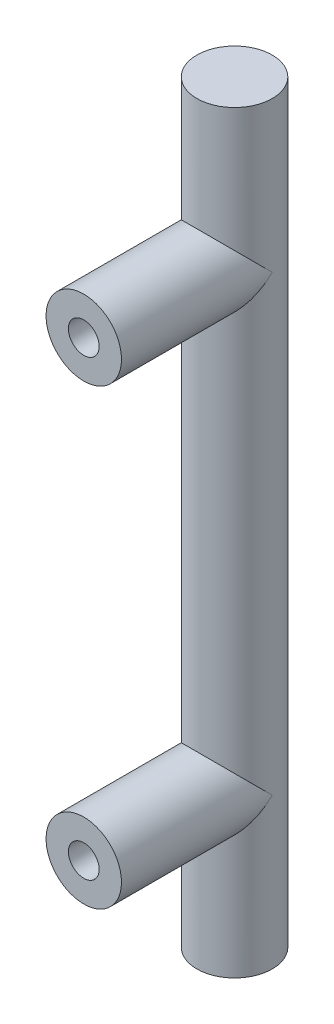
ISO-10303-21;
HEADER;
FILE_DESCRIPTION(('STEP AP214'),'2;1');
FILE_NAME('part.step','',(''),(''),'','','');
FILE_SCHEMA(('AUTOMOTIVE_DESIGN { 1 0 10303 214 1 1 1 1 }'));
ENDSEC;
DATA;
#1=APPLICATION_CONTEXT('core data for automotive mechanical design processes');
#2=APPLICATION_PROTOCOL_DEFINITION('international standard','automotive_design',2000,#1);
#3=PRODUCT_CONTEXT('',#1,'mechanical');
#4=PRODUCT('Part','Part','',(#3));
#5=PRODUCT_RELATED_PRODUCT_CATEGORY('part','',(#4));
#6=PRODUCT_DEFINITION_FORMATION('','',#4);
#7=PRODUCT_DEFINITION_CONTEXT('part definition',#1,'design');
#8=PRODUCT_DEFINITION('design','',#6,#7);
#9=PRODUCT_DEFINITION_SHAPE('','',#8);
#10=(LENGTH_UNIT() NAMED_UNIT(*) SI_UNIT(.MILLI.,.METRE.));
#11=(NAMED_UNIT(*) PLANE_ANGLE_UNIT() SI_UNIT($,.RADIAN.));
#12=(NAMED_UNIT(*) SI_UNIT($,.STERADIAN.) SOLID_ANGLE_UNIT());
#13=UNCERTAINTY_MEASURE_WITH_UNIT(LENGTH_MEASURE(1.E-05),#10,'distance_accuracy_value','');
#14=(GEOMETRIC_REPRESENTATION_CONTEXT(3) GLOBAL_UNCERTAINTY_ASSIGNED_CONTEXT((#13)) GLOBAL_UNIT_ASSIGNED_CONTEXT((#10,
#11,#12)) REPRESENTATION_CONTEXT('',''));
#15=CARTESIAN_POINT('',(0.,0.,0.));
#16=DIRECTION('',(0.,0.,1.));
#17=DIRECTION('',(1.,0.,0.));
#18=AXIS2_PLACEMENT_3D('',#15,#16,#17);
#19=CARTESIAN_POINT('',(0.,127.,0.));
#20=DIRECTION('',(0.,-1.,0.));
#21=DIRECTION('',(0.,0.,-1.));
#22=AXIS2_PLACEMENT_3D('',#19,#20,#21);
#23=CYLINDRICAL_SURFACE('',#22,6.35);
#24=CARTESIAN_POINT('',(0.,101.646656127817,0.));
#25=DIRECTION('',(0.,-0.707106781186547,-0.707106781186547));
#26=DIRECTION('',(0.,-0.707106781186547,0.707106781186547));
#27=AXIS2_PLACEMENT_3D('',#24,#25,#26);
#28=ELLIPSE('',#27,8.98025612106915,6.35);
#29=CARTESIAN_POINT('',(-6.35,101.646656127817,0.));
#30=VERTEX_POINT('',#29);
#31=CARTESIAN_POINT('',(6.35,101.646656127817,0.));
#32=VERTEX_POINT('',#31);
#33=EDGE_CURVE('E116',#30,#32,#28,.F.);
#34=ORIENTED_EDGE('',*,*,#33,.F.);
#35=CARTESIAN_POINT('',(0.,101.646656127817,0.));
#36=DIRECTION('',(0.,-0.707106781186547,0.707106781186547));
#37=DIRECTION('',(0.,-0.707106781186547,-0.707106781186547));
#38=AXIS2_PLACEMENT_3D('',#35,#36,#37);
#39=ELLIPSE('',#38,8.98025612106915,6.35);
#40=EDGE_CURVE('E61',#32,#30,#39,.T.);
#41=ORIENTED_EDGE('',*,*,#40,.F.);
#42=EDGE_LOOP('',(#34,#41));
#43=FACE_BOUND('',#42,.T.);
#44=CARTESIAN_POINT('',(0.,127.,0.));
#45=DIRECTION('',(0.,1.,0.));
#46=DIRECTION('',(0.,0.,1.));
#47=AXIS2_PLACEMENT_3D('',#44,#45,#46);
#48=CIRCLE('',#47,6.35);
#49=CARTESIAN_POINT('',(0.,127.,6.35));
#50=VERTEX_POINT('',#49);
#51=EDGE_CURVE('E107',#50,#50,#48,.T.);
#52=ORIENTED_EDGE('',*,*,#51,.F.);
#53=EDGE_LOOP('',(#52));
#54=FACE_BOUND('',#53,.T.);
#55=CARTESIAN_POINT('',(0.,0.,0.));
#56=DIRECTION('',(0.,1.,0.));
#57=DIRECTION('',(0.,0.,1.));
#58=AXIS2_PLACEMENT_3D('',#55,#56,#57);
#59=CIRCLE('',#58,6.35);
#60=CARTESIAN_POINT('',(0.,0.,6.35));
#61=VERTEX_POINT('',#60);
#62=EDGE_CURVE('E106',#61,#61,#59,.T.);
#63=ORIENTED_EDGE('',*,*,#62,.T.);
#64=EDGE_LOOP('',(#63));
#65=FACE_BOUND('',#64,.T.);
#66=CARTESIAN_POINT('',(0.,25.3533438721831,0.));
#67=DIRECTION('',(0.,-0.707106781186547,-0.707106781186547));
#68=DIRECTION('',(0.,-0.707106781186547,0.707106781186547));
#69=AXIS2_PLACEMENT_3D('',#66,#67,#68);
#70=ELLIPSE('',#69,8.98025612106915,6.35);
#71=CARTESIAN_POINT('',(-6.35,25.3533438721831,0.));
#72=VERTEX_POINT('',#71);
#73=CARTESIAN_POINT('',(6.35,25.3533438721831,0.));
#74=VERTEX_POINT('',#73);
#75=EDGE_CURVE('E11',#72,#74,#70,.F.);
#76=ORIENTED_EDGE('',*,*,#75,.F.);
#77=CARTESIAN_POINT('',(0.,25.3533438721831,0.));
#78=DIRECTION('',(0.,-0.707106781186547,0.707106781186547));
#79=DIRECTION('',(0.,-0.707106781186547,-0.707106781186547));
#80=AXIS2_PLACEMENT_3D('',#77,#78,#79);
#81=ELLIPSE('',#80,8.98025612106915,6.35);
#82=EDGE_CURVE('E50',#74,#72,#81,.T.);
#83=ORIENTED_EDGE('',*,*,#82,.F.);
#84=EDGE_LOOP('',(#76,#83));
#85=FACE_BOUND('',#84,.T.);
#86=ADVANCED_FACE('F42',(#43,#54,#65,#85),#23,.T.);
#87=CARTESIAN_POINT('',(0.,127.,0.));
#88=DIRECTION('',(0.,1.,0.));
#89=DIRECTION('',(0.,0.,1.));
#90=AXIS2_PLACEMENT_3D('',#87,#88,#89);
#91=PLANE('',#90);
#92=ORIENTED_EDGE('',*,*,#51,.T.);
#93=EDGE_LOOP('',(#92));
#94=FACE_BOUND('',#93,.T.);
#95=ADVANCED_FACE('F122',(#94),#91,.T.);
#96=CARTESIAN_POINT('',(0.,0.,0.));
#97=DIRECTION('',(0.,1.,0.));
#98=DIRECTION('',(0.,0.,1.));
#99=AXIS2_PLACEMENT_3D('',#96,#97,#98);
#100=PLANE('',#99);
#101=ORIENTED_EDGE('',*,*,#62,.F.);
#102=EDGE_LOOP('',(#101));
#103=FACE_BOUND('',#102,.T.);
#104=ADVANCED_FACE('F126',(#103),#100,.F.);
#105=CARTESIAN_POINT('',(0.,101.646656127817,25.4));
#106=DIRECTION('',(0.,0.,-1.));
#107=DIRECTION('',(-1.,0.,0.));
#108=AXIS2_PLACEMENT_3D('',#105,#106,#107);
#109=CYLINDRICAL_SURFACE('',#108,6.35);
#110=CARTESIAN_POINT('',(0.,101.646656127817,25.4));
#111=DIRECTION('',(0.,0.,1.));
#112=DIRECTION('',(1.,0.,0.));
#113=AXIS2_PLACEMENT_3D('',#110,#111,#112);
#114=CIRCLE('',#113,6.35);
#115=CARTESIAN_POINT('',(6.35,101.646656127817,25.4));
#116=VERTEX_POINT('',#115);
#117=EDGE_CURVE('E102',#116,#116,#114,.T.);
#118=ORIENTED_EDGE('',*,*,#117,.F.);
#119=EDGE_LOOP('',(#118));
#120=FACE_BOUND('',#119,.T.);
#121=ORIENTED_EDGE('',*,*,#40,.T.);
#122=ORIENTED_EDGE('',*,*,#33,.T.);
#123=EDGE_LOOP('',(#121,#122));
#124=FACE_BOUND('',#123,.T.);
#125=ADVANCED_FACE('F135',(#120,#124),#109,.T.);
#126=CARTESIAN_POINT('',(0.,101.646656127817,25.4));
#127=DIRECTION('',(0.,0.,1.));
#128=DIRECTION('',(1.,0.,0.));
#129=AXIS2_PLACEMENT_3D('',#126,#127,#128);
#130=PLANE('',#129);
#131=CARTESIAN_POINT('',(0.,101.646656127817,25.4));
#132=DIRECTION('',(0.,0.,1.));
#133=DIRECTION('',(1.,0.,0.));
#134=AXIS2_PLACEMENT_3D('',#131,#132,#133);
#135=CIRCLE('',#134,2.59079999999999);
#136=CARTESIAN_POINT('',(2.59079999999999,101.646656127817,25.4));
#137=VERTEX_POINT('',#136);
#138=EDGE_CURVE('E85',#137,#137,#135,.T.);
#139=ORIENTED_EDGE('',*,*,#138,.F.);
#140=EDGE_LOOP('',(#139));
#141=FACE_BOUND('',#140,.T.);
#142=ORIENTED_EDGE('',*,*,#117,.T.);
#143=EDGE_LOOP('',(#142));
#144=FACE_BOUND('',#143,.T.);
#145=ADVANCED_FACE('F139',(#141,#144),#130,.T.);
#146=CARTESIAN_POINT('',(0.,25.3533438721831,25.4));
#147=DIRECTION('',(0.,0.,-1.));
#148=DIRECTION('',(-1.,0.,0.));
#149=AXIS2_PLACEMENT_3D('',#146,#147,#148);
#150=CYLINDRICAL_SURFACE('',#149,6.35);
#151=CARTESIAN_POINT('',(0.,25.3533438721831,25.4));
#152=DIRECTION('',(0.,0.,1.));
#153=DIRECTION('',(1.,0.,0.));
#154=AXIS2_PLACEMENT_3D('',#151,#152,#153);
#155=CIRCLE('',#154,6.35);
#156=CARTESIAN_POINT('',(6.35,25.3533438721831,25.4));
#157=VERTEX_POINT('',#156);
#158=EDGE_CURVE('E98',#157,#157,#155,.T.);
#159=ORIENTED_EDGE('',*,*,#158,.F.);
#160=EDGE_LOOP('',(#159));
#161=FACE_BOUND('',#160,.T.);
#162=ORIENTED_EDGE('',*,*,#82,.T.);
#163=ORIENTED_EDGE('',*,*,#75,.T.);
#164=EDGE_LOOP('',(#162,#163));
#165=FACE_BOUND('',#164,.T.);
#166=ADVANCED_FACE('F120',(#161,#165),#150,.T.);
#167=CARTESIAN_POINT('',(0.,25.3533438721831,25.4));
#168=DIRECTION('',(0.,0.,1.));
#169=DIRECTION('',(1.,0.,0.));
#170=AXIS2_PLACEMENT_3D('',#167,#168,#169);
#171=PLANE('',#170);
#172=CARTESIAN_POINT('',(0.,25.3533438721831,25.4));
#173=DIRECTION('',(0.,0.,1.));
#174=DIRECTION('',(1.,0.,0.));
#175=AXIS2_PLACEMENT_3D('',#172,#173,#174);
#176=CIRCLE('',#175,2.59079999999999);
#177=CARTESIAN_POINT('',(2.59079999999999,25.3533438721831,25.4));
#178=VERTEX_POINT('',#177);
#179=EDGE_CURVE('E84',#178,#178,#176,.T.);
#180=ORIENTED_EDGE('',*,*,#179,.F.);
#181=EDGE_LOOP('',(#180));
#182=FACE_BOUND('',#181,.T.);
#183=ORIENTED_EDGE('',*,*,#158,.T.);
#184=EDGE_LOOP('',(#183));
#185=FACE_BOUND('',#184,.T.);
#186=ADVANCED_FACE('F146',(#182,#185),#171,.T.);
#187=CARTESIAN_POINT('',(0.,25.3533438721831,12.7));
#188=DIRECTION('',(0.,0.,1.));
#189=DIRECTION('',(1.,0.,0.));
#190=AXIS2_PLACEMENT_3D('',#187,#188,#189);
#191=CONICAL_SURFACE('',#190,2.59079999999999,1.02974425867665);
#192=CARTESIAN_POINT('',(0.,25.3533438721831,11.1432903082234));
#193=VERTEX_POINT('',#192);
#194=VERTEX_LOOP('',#193);
#195=FACE_BOUND('',#194,.T.);
#196=CARTESIAN_POINT('',(0.,25.3533438721831,12.7));
#197=DIRECTION('',(0.,0.,1.));
#198=DIRECTION('',(1.,0.,0.));
#199=AXIS2_PLACEMENT_3D('',#196,#197,#198);
#200=CIRCLE('',#199,2.59079999999999);
#201=CARTESIAN_POINT('',(2.59079999999999,25.3533438721831,12.7));
#202=VERTEX_POINT('',#201);
#203=EDGE_CURVE('E90',#202,#202,#200,.T.);
#204=ORIENTED_EDGE('',*,*,#203,.T.);
#205=EDGE_LOOP('',(#204));
#206=FACE_BOUND('',#205,.T.);
#207=ADVANCED_FACE('F149',(#195,#206),#191,.F.);
#208=CARTESIAN_POINT('',(0.,25.3533438721831,25.4));
#209=DIRECTION('',(0.,0.,1.));
#210=DIRECTION('',(1.,0.,0.));
#211=AXIS2_PLACEMENT_3D('',#208,#209,#210);
#212=CYLINDRICAL_SURFACE('',#211,2.59079999999999);
#213=ORIENTED_EDGE('',*,*,#203,.F.);
#214=EDGE_LOOP('',(#213));
#215=FACE_BOUND('',#214,.T.);
#216=ORIENTED_EDGE('',*,*,#179,.T.);
#217=EDGE_LOOP('',(#216));
#218=FACE_BOUND('',#217,.T.);
#219=ADVANCED_FACE('F77',(#215,#218),#212,.F.);
#220=CARTESIAN_POINT('',(0.,101.646656127817,12.7));
#221=DIRECTION('',(0.,0.,1.));
#222=DIRECTION('',(1.,0.,0.));
#223=AXIS2_PLACEMENT_3D('',#220,#221,#222);
#224=CONICAL_SURFACE('',#223,2.59079999999999,1.02974425867665);
#225=CARTESIAN_POINT('',(0.,101.646656127817,11.1432903082234));
#226=VERTEX_POINT('',#225);
#227=VERTEX_LOOP('',#226);
#228=FACE_BOUND('',#227,.T.);
#229=CARTESIAN_POINT('',(0.,101.646656127817,12.7));
#230=DIRECTION('',(0.,0.,1.));
#231=DIRECTION('',(1.,0.,0.));
#232=AXIS2_PLACEMENT_3D('',#229,#230,#231);
#233=CIRCLE('',#232,2.59079999999999);
#234=CARTESIAN_POINT('',(2.59079999999999,101.646656127817,12.7));
#235=VERTEX_POINT('',#234);
#236=EDGE_CURVE('E81',#235,#235,#233,.T.);
#237=ORIENTED_EDGE('',*,*,#236,.T.);
#238=EDGE_LOOP('',(#237));
#239=FACE_BOUND('',#238,.T.);
#240=ADVANCED_FACE('F73',(#228,#239),#224,.F.);
#241=CARTESIAN_POINT('',(0.,101.646656127817,25.4));
#242=DIRECTION('',(0.,0.,1.));
#243=DIRECTION('',(1.,0.,0.));
#244=AXIS2_PLACEMENT_3D('',#241,#242,#243);
#245=CYLINDRICAL_SURFACE('',#244,2.59079999999999);
#246=ORIENTED_EDGE('',*,*,#236,.F.);
#247=EDGE_LOOP('',(#246));
#248=FACE_BOUND('',#247,.T.);
#249=ORIENTED_EDGE('',*,*,#138,.T.);
#250=EDGE_LOOP('',(#249));
#251=FACE_BOUND('',#250,.T.);
#252=ADVANCED_FACE('F76',(#248,#251),#245,.F.);
#253=CLOSED_SHELL('',(#86,#95,#104,#125,#145,#166,#186,#207,#219,#240,#252));
#254=MANIFOLD_SOLID_BREP('B2',#253);
#255=ADVANCED_BREP_SHAPE_REPRESENTATION('',(#18,#254),#14);
#256=SHAPE_DEFINITION_REPRESENTATION(#9,#255);
ENDSEC;
END-ISO-10303-21;
